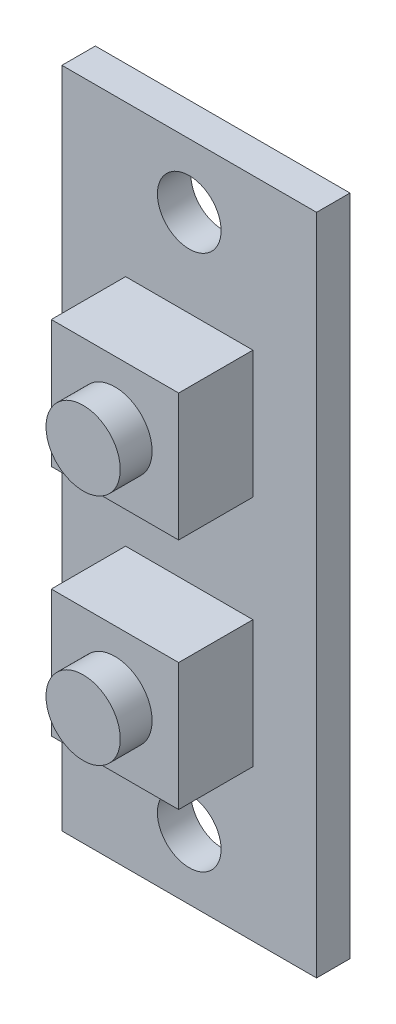
ISO-10303-21;
HEADER;
FILE_DESCRIPTION(('STEP AP214'),'2;1');
FILE_NAME('part.step','',(''),(''),'','','');
FILE_SCHEMA(('AUTOMOTIVE_DESIGN { 1 0 10303 214 1 1 1 1 }'));
ENDSEC;
DATA;
#1=APPLICATION_CONTEXT('core data for automotive mechanical design processes');
#2=APPLICATION_PROTOCOL_DEFINITION('international standard','automotive_design',2000,#1);
#3=PRODUCT_CONTEXT('',#1,'mechanical');
#4=PRODUCT('Part','Part','',(#3));
#5=PRODUCT_RELATED_PRODUCT_CATEGORY('part','',(#4));
#6=PRODUCT_DEFINITION_FORMATION('','',#4);
#7=PRODUCT_DEFINITION_CONTEXT('part definition',#1,'design');
#8=PRODUCT_DEFINITION('design','',#6,#7);
#9=PRODUCT_DEFINITION_SHAPE('','',#8);
#10=(LENGTH_UNIT() NAMED_UNIT(*) SI_UNIT(.MILLI.,.METRE.));
#11=(NAMED_UNIT(*) PLANE_ANGLE_UNIT() SI_UNIT($,.RADIAN.));
#12=(NAMED_UNIT(*) SI_UNIT($,.STERADIAN.) SOLID_ANGLE_UNIT());
#13=UNCERTAINTY_MEASURE_WITH_UNIT(LENGTH_MEASURE(1.E-05),#10,'distance_accuracy_value','');
#14=(GEOMETRIC_REPRESENTATION_CONTEXT(3) GLOBAL_UNCERTAINTY_ASSIGNED_CONTEXT((#13)) GLOBAL_UNIT_ASSIGNED_CONTEXT((#10,
#11,#12)) REPRESENTATION_CONTEXT('',''));
#15=CARTESIAN_POINT('',(0.,0.,0.));
#16=DIRECTION('',(0.,0.,1.));
#17=DIRECTION('',(1.,0.,0.));
#18=AXIS2_PLACEMENT_3D('',#15,#16,#17);
#19=CARTESIAN_POINT('',(0.,0.,1.6002));
#20=DIRECTION('',(0.,0.,-1.));
#21=DIRECTION('',(-1.,0.,0.));
#22=AXIS2_PLACEMENT_3D('',#19,#20,#21);
#23=PLANE('',#22);
#24=CARTESIAN_POINT('',(0.,12.827,1.6002));
#25=DIRECTION('',(0.,0.,-1.));
#26=DIRECTION('',(-1.,0.,0.));
#27=AXIS2_PLACEMENT_3D('',#24,#25,#26);
#28=CIRCLE('',#27,1.524);
#29=CARTESIAN_POINT('',(-1.524,12.827,1.6002));
#30=VERTEX_POINT('',#29);
#31=EDGE_CURVE('E430',#30,#30,#28,.T.);
#32=ORIENTED_EDGE('',*,*,#31,.T.);
#33=EDGE_LOOP('',(#32));
#34=FACE_BOUND('',#33,.T.);
#35=CARTESIAN_POINT('',(0.,-12.827,1.6002));
#36=DIRECTION('',(0.,0.,-1.));
#37=DIRECTION('',(-1.,0.,0.));
#38=AXIS2_PLACEMENT_3D('',#35,#36,#37);
#39=CIRCLE('',#38,1.524);
#40=CARTESIAN_POINT('',(-1.524,-12.827,1.6002));
#41=VERTEX_POINT('',#40);
#42=EDGE_CURVE('E432',#41,#41,#39,.T.);
#43=ORIENTED_EDGE('',*,*,#42,.T.);
#44=EDGE_LOOP('',(#43));
#45=FACE_BOUND('',#44,.T.);
#46=DIRECTION('',(0.,-1.,0.));
#47=VECTOR('',#46,1.);
#48=CARTESIAN_POINT('',(-3.048,2.54,1.6002));
#49=LINE('',#48,#47);
#50=CARTESIAN_POINT('',(-3.048,8.636,1.6002));
#51=VERTEX_POINT('',#50);
#52=CARTESIAN_POINT('',(-3.048,2.54,1.6002));
#53=VERTEX_POINT('',#52);
#54=EDGE_CURVE('E147',#51,#53,#49,.T.);
#55=ORIENTED_EDGE('',*,*,#54,.F.);
#56=DIRECTION('',(-1.,0.,0.));
#57=VECTOR('',#56,1.);
#58=CARTESIAN_POINT('',(-3.048,8.636,1.6002));
#59=LINE('',#58,#57);
#60=CARTESIAN_POINT('',(3.048,8.636,1.6002));
#61=VERTEX_POINT('',#60);
#62=EDGE_CURVE('E160',#61,#51,#59,.T.);
#63=ORIENTED_EDGE('',*,*,#62,.F.);
#64=DIRECTION('',(0.,1.,0.));
#65=VECTOR('',#64,1.);
#66=CARTESIAN_POINT('',(3.048,2.54,1.6002));
#67=LINE('',#66,#65);
#68=CARTESIAN_POINT('',(3.048,2.54,1.6002));
#69=VERTEX_POINT('',#68);
#70=EDGE_CURVE('E169',#69,#61,#67,.T.);
#71=ORIENTED_EDGE('',*,*,#70,.F.);
#72=DIRECTION('',(1.,0.,0.));
#73=VECTOR('',#72,1.);
#74=CARTESIAN_POINT('',(-3.048,2.54,1.6002));
#75=LINE('',#74,#73);
#76=EDGE_CURVE('E150',#53,#69,#75,.T.);
#77=ORIENTED_EDGE('',*,*,#76,.F.);
#78=EDGE_LOOP('',(#55,#63,#71,#77));
#79=FACE_BOUND('',#78,.T.);
#80=DIRECTION('',(0.,1.,0.));
#81=VECTOR('',#80,1.);
#82=CARTESIAN_POINT('',(6.096,-15.875,1.6002));
#83=LINE('',#82,#81);
#84=CARTESIAN_POINT('',(6.096,-15.875,1.6002));
#85=VERTEX_POINT('',#84);
#86=CARTESIAN_POINT('',(6.096,15.875,1.6002));
#87=VERTEX_POINT('',#86);
#88=EDGE_CURVE('E186',#85,#87,#83,.T.);
#89=ORIENTED_EDGE('',*,*,#88,.T.);
#90=DIRECTION('',(-1.,0.,0.));
#91=VECTOR('',#90,1.);
#92=CARTESIAN_POINT('',(-6.096,15.875,1.6002));
#93=LINE('',#92,#91);
#94=CARTESIAN_POINT('',(-6.096,15.875,1.6002));
#95=VERTEX_POINT('',#94);
#96=EDGE_CURVE('E189',#87,#95,#93,.T.);
#97=ORIENTED_EDGE('',*,*,#96,.T.);
#98=DIRECTION('',(0.,-1.,0.));
#99=VECTOR('',#98,1.);
#100=CARTESIAN_POINT('',(-6.096,-15.875,1.6002));
#101=LINE('',#100,#99);
#102=CARTESIAN_POINT('',(-6.096,-15.875,1.6002));
#103=VERTEX_POINT('',#102);
#104=EDGE_CURVE('E192',#95,#103,#101,.T.);
#105=ORIENTED_EDGE('',*,*,#104,.T.);
#106=DIRECTION('',(1.,0.,0.));
#107=VECTOR('',#106,1.);
#108=CARTESIAN_POINT('',(-6.096,-15.875,1.6002));
#109=LINE('',#108,#107);
#110=EDGE_CURVE('E194',#103,#85,#109,.T.);
#111=ORIENTED_EDGE('',*,*,#110,.T.);
#112=EDGE_LOOP('',(#89,#97,#105,#111));
#113=FACE_BOUND('',#112,.T.);
#114=DIRECTION('',(0.,-1.,0.));
#115=VECTOR('',#114,1.);
#116=CARTESIAN_POINT('',(-3.048,-2.54,1.6002));
#117=LINE('',#116,#115);
#118=CARTESIAN_POINT('',(-3.048,-2.54,1.6002));
#119=VERTEX_POINT('',#118);
#120=CARTESIAN_POINT('',(-3.048,-8.636,1.6002));
#121=VERTEX_POINT('',#120);
#122=EDGE_CURVE('E146',#119,#121,#117,.T.);
#123=ORIENTED_EDGE('',*,*,#122,.F.);
#124=DIRECTION('',(-1.,0.,0.));
#125=VECTOR('',#124,1.);
#126=CARTESIAN_POINT('',(-3.048,-2.54,1.6002));
#127=LINE('',#126,#125);
#128=CARTESIAN_POINT('',(3.048,-2.54,1.6002));
#129=VERTEX_POINT('',#128);
#130=EDGE_CURVE('E143',#129,#119,#127,.T.);
#131=ORIENTED_EDGE('',*,*,#130,.F.);
#132=DIRECTION('',(0.,1.,0.));
#133=VECTOR('',#132,1.);
#134=CARTESIAN_POINT('',(3.048,-2.54,1.6002));
#135=LINE('',#134,#133);
#136=CARTESIAN_POINT('',(3.048,-8.636,1.6002));
#137=VERTEX_POINT('',#136);
#138=EDGE_CURVE('E57',#137,#129,#135,.T.);
#139=ORIENTED_EDGE('',*,*,#138,.F.);
#140=DIRECTION('',(1.,0.,0.));
#141=VECTOR('',#140,1.);
#142=CARTESIAN_POINT('',(-3.048,-8.636,1.6002));
#143=LINE('',#142,#141);
#144=EDGE_CURVE('E52',#121,#137,#143,.T.);
#145=ORIENTED_EDGE('',*,*,#144,.F.);
#146=EDGE_LOOP('',(#123,#131,#139,#145));
#147=FACE_BOUND('',#146,.T.);
#148=ADVANCED_FACE('F35',(#34,#45,#79,#113,#147),#23,.F.);
#149=CARTESIAN_POINT('',(6.096,-15.875,1.6002));
#150=DIRECTION('',(-1.,0.,0.));
#151=DIRECTION('',(0.,0.,1.));
#152=AXIS2_PLACEMENT_3D('',#149,#150,#151);
#153=PLANE('',#152);
#154=DIRECTION('',(0.,1.,0.));
#155=VECTOR('',#154,1.);
#156=CARTESIAN_POINT('',(6.096,-15.875,0.));
#157=LINE('',#156,#155);
#158=CARTESIAN_POINT('',(6.096,-15.875,0.));
#159=VERTEX_POINT('',#158);
#160=CARTESIAN_POINT('',(6.096,15.875,0.));
#161=VERTEX_POINT('',#160);
#162=EDGE_CURVE('E185',#159,#161,#157,.T.);
#163=ORIENTED_EDGE('',*,*,#162,.T.);
#164=DIRECTION('',(0.,0.,-1.));
#165=VECTOR('',#164,1.);
#166=CARTESIAN_POINT('',(6.096,15.875,1.6002));
#167=LINE('',#166,#165);
#168=EDGE_CURVE('E39',#87,#161,#167,.T.);
#169=ORIENTED_EDGE('',*,*,#168,.F.);
#170=ORIENTED_EDGE('',*,*,#88,.F.);
#171=DIRECTION('',(0.,0.,-1.));
#172=VECTOR('',#171,1.);
#173=CARTESIAN_POINT('',(6.096,-15.875,1.6002));
#174=LINE('',#173,#172);
#175=EDGE_CURVE('E196',#85,#159,#174,.T.);
#176=ORIENTED_EDGE('',*,*,#175,.T.);
#177=EDGE_LOOP('',(#163,#169,#170,#176));
#178=FACE_BOUND('',#177,.T.);
#179=ADVANCED_FACE('F37',(#178),#153,.F.);
#180=CARTESIAN_POINT('',(-6.096,15.875,1.6002));
#181=DIRECTION('',(0.,-1.,0.));
#182=DIRECTION('',(0.,0.,-1.));
#183=AXIS2_PLACEMENT_3D('',#180,#181,#182);
#184=PLANE('',#183);
#185=DIRECTION('',(-1.,0.,0.));
#186=VECTOR('',#185,1.);
#187=CARTESIAN_POINT('',(-6.096,15.875,0.));
#188=LINE('',#187,#186);
#189=CARTESIAN_POINT('',(-6.096,15.875,0.));
#190=VERTEX_POINT('',#189);
#191=EDGE_CURVE('E199',#161,#190,#188,.T.);
#192=ORIENTED_EDGE('',*,*,#191,.T.);
#193=DIRECTION('',(0.,0.,-1.));
#194=VECTOR('',#193,1.);
#195=CARTESIAN_POINT('',(-6.096,15.875,1.6002));
#196=LINE('',#195,#194);
#197=EDGE_CURVE('E208',#95,#190,#196,.T.);
#198=ORIENTED_EDGE('',*,*,#197,.F.);
#199=ORIENTED_EDGE('',*,*,#96,.F.);
#200=ORIENTED_EDGE('',*,*,#168,.T.);
#201=EDGE_LOOP('',(#192,#198,#199,#200));
#202=FACE_BOUND('',#201,.T.);
#203=ADVANCED_FACE('F252',(#202),#184,.F.);
#204=CARTESIAN_POINT('',(-6.096,-15.875,1.6002));
#205=DIRECTION('',(1.,0.,0.));
#206=DIRECTION('',(0.,0.,-1.));
#207=AXIS2_PLACEMENT_3D('',#204,#205,#206);
#208=PLANE('',#207);
#209=DIRECTION('',(0.,-1.,0.));
#210=VECTOR('',#209,1.);
#211=CARTESIAN_POINT('',(-6.096,-15.875,0.));
#212=LINE('',#211,#210);
#213=CARTESIAN_POINT('',(-6.096,-15.875,0.));
#214=VERTEX_POINT('',#213);
#215=EDGE_CURVE('E201',#190,#214,#212,.T.);
#216=ORIENTED_EDGE('',*,*,#215,.T.);
#217=DIRECTION('',(0.,0.,-1.));
#218=VECTOR('',#217,1.);
#219=CARTESIAN_POINT('',(-6.096,-15.875,1.6002));
#220=LINE('',#219,#218);
#221=EDGE_CURVE('E206',#103,#214,#220,.T.);
#222=ORIENTED_EDGE('',*,*,#221,.F.);
#223=ORIENTED_EDGE('',*,*,#104,.F.);
#224=ORIENTED_EDGE('',*,*,#197,.T.);
#225=EDGE_LOOP('',(#216,#222,#223,#224));
#226=FACE_BOUND('',#225,.T.);
#227=ADVANCED_FACE('F267',(#226),#208,.F.);
#228=CARTESIAN_POINT('',(-6.096,-15.875,1.6002));
#229=DIRECTION('',(0.,1.,0.));
#230=DIRECTION('',(0.,0.,1.));
#231=AXIS2_PLACEMENT_3D('',#228,#229,#230);
#232=PLANE('',#231);
#233=DIRECTION('',(1.,0.,0.));
#234=VECTOR('',#233,1.);
#235=CARTESIAN_POINT('',(-6.096,-15.875,0.));
#236=LINE('',#235,#234);
#237=EDGE_CURVE('E190',#214,#159,#236,.T.);
#238=ORIENTED_EDGE('',*,*,#237,.T.);
#239=ORIENTED_EDGE('',*,*,#175,.F.);
#240=ORIENTED_EDGE('',*,*,#110,.F.);
#241=ORIENTED_EDGE('',*,*,#221,.T.);
#242=EDGE_LOOP('',(#238,#239,#240,#241));
#243=FACE_BOUND('',#242,.T.);
#244=ADVANCED_FACE('F263',(#243),#232,.F.);
#245=CARTESIAN_POINT('',(0.,0.,0.));
#246=DIRECTION('',(0.,0.,-1.));
#247=DIRECTION('',(-1.,0.,0.));
#248=AXIS2_PLACEMENT_3D('',#245,#246,#247);
#249=PLANE('',#248);
#250=CARTESIAN_POINT('',(0.,12.827,0.));
#251=DIRECTION('',(0.,0.,1.));
#252=DIRECTION('',(1.,0.,0.));
#253=AXIS2_PLACEMENT_3D('',#250,#251,#252);
#254=CIRCLE('',#253,1.524);
#255=CARTESIAN_POINT('',(1.524,12.827,0.));
#256=VERTEX_POINT('',#255);
#257=EDGE_CURVE('E428',#256,#256,#254,.T.);
#258=ORIENTED_EDGE('',*,*,#257,.T.);
#259=EDGE_LOOP('',(#258));
#260=FACE_BOUND('',#259,.T.);
#261=CARTESIAN_POINT('',(0.,-12.827,0.));
#262=DIRECTION('',(0.,0.,1.));
#263=DIRECTION('',(1.,0.,0.));
#264=AXIS2_PLACEMENT_3D('',#261,#262,#263);
#265=CIRCLE('',#264,1.524);
#266=CARTESIAN_POINT('',(1.524,-12.827,0.));
#267=VERTEX_POINT('',#266);
#268=EDGE_CURVE('E439',#267,#267,#265,.T.);
#269=ORIENTED_EDGE('',*,*,#268,.T.);
#270=EDGE_LOOP('',(#269));
#271=FACE_BOUND('',#270,.T.);
#272=ORIENTED_EDGE('',*,*,#162,.F.);
#273=ORIENTED_EDGE('',*,*,#237,.F.);
#274=ORIENTED_EDGE('',*,*,#215,.F.);
#275=ORIENTED_EDGE('',*,*,#191,.F.);
#276=EDGE_LOOP('',(#272,#273,#274,#275));
#277=FACE_BOUND('',#276,.T.);
#278=ADVANCED_FACE('F260',(#260,#271,#277),#249,.T.);
#279=CARTESIAN_POINT('',(-3.048,2.54,5.1562));
#280=DIRECTION('',(1.,0.,0.));
#281=DIRECTION('',(0.,0.,-1.));
#282=AXIS2_PLACEMENT_3D('',#279,#280,#281);
#283=PLANE('',#282);
#284=ORIENTED_EDGE('',*,*,#54,.T.);
#285=DIRECTION('',(0.,0.,-1.));
#286=VECTOR('',#285,1.);
#287=CARTESIAN_POINT('',(-3.048,2.54,5.1562));
#288=LINE('',#287,#286);
#289=CARTESIAN_POINT('',(-3.048,2.54,5.1562));
#290=VERTEX_POINT('',#289);
#291=EDGE_CURVE('E182',#290,#53,#288,.T.);
#292=ORIENTED_EDGE('',*,*,#291,.F.);
#293=DIRECTION('',(0.,-1.,0.));
#294=VECTOR('',#293,1.);
#295=CARTESIAN_POINT('',(-3.048,2.54,5.1562));
#296=LINE('',#295,#294);
#297=CARTESIAN_POINT('',(-3.048,8.636,5.1562));
#298=VERTEX_POINT('',#297);
#299=EDGE_CURVE('E156',#298,#290,#296,.T.);
#300=ORIENTED_EDGE('',*,*,#299,.F.);
#301=DIRECTION('',(0.,0.,-1.));
#302=VECTOR('',#301,1.);
#303=CARTESIAN_POINT('',(-3.048,8.636,5.1562));
#304=LINE('',#303,#302);
#305=EDGE_CURVE('E165',#298,#51,#304,.T.);
#306=ORIENTED_EDGE('',*,*,#305,.T.);
#307=EDGE_LOOP('',(#284,#292,#300,#306));
#308=FACE_BOUND('',#307,.T.);
#309=ADVANCED_FACE('F258',(#308),#283,.F.);
#310=CARTESIAN_POINT('',(-3.048,2.54,5.1562));
#311=DIRECTION('',(0.,1.,0.));
#312=DIRECTION('',(0.,0.,1.));
#313=AXIS2_PLACEMENT_3D('',#310,#311,#312);
#314=PLANE('',#313);
#315=ORIENTED_EDGE('',*,*,#76,.T.);
#316=DIRECTION('',(0.,0.,-1.));
#317=VECTOR('',#316,1.);
#318=CARTESIAN_POINT('',(3.048,2.54,5.1562));
#319=LINE('',#318,#317);
#320=CARTESIAN_POINT('',(3.048,2.54,5.1562));
#321=VERTEX_POINT('',#320);
#322=EDGE_CURVE('E179',#321,#69,#319,.T.);
#323=ORIENTED_EDGE('',*,*,#322,.F.);
#324=DIRECTION('',(1.,0.,0.));
#325=VECTOR('',#324,1.);
#326=CARTESIAN_POINT('',(-3.048,2.54,5.1562));
#327=LINE('',#326,#325);
#328=EDGE_CURVE('E159',#290,#321,#327,.T.);
#329=ORIENTED_EDGE('',*,*,#328,.F.);
#330=ORIENTED_EDGE('',*,*,#291,.T.);
#331=EDGE_LOOP('',(#315,#323,#329,#330));
#332=FACE_BOUND('',#331,.T.);
#333=ADVANCED_FACE('F302',(#332),#314,.F.);
#334=CARTESIAN_POINT('',(3.048,2.54,5.1562));
#335=DIRECTION('',(-1.,0.,0.));
#336=DIRECTION('',(0.,0.,1.));
#337=AXIS2_PLACEMENT_3D('',#334,#335,#336);
#338=PLANE('',#337);
#339=ORIENTED_EDGE('',*,*,#70,.T.);
#340=DIRECTION('',(0.,0.,-1.));
#341=VECTOR('',#340,1.);
#342=CARTESIAN_POINT('',(3.048,8.636,5.1562));
#343=LINE('',#342,#341);
#344=CARTESIAN_POINT('',(3.048,8.636,5.1562));
#345=VERTEX_POINT('',#344);
#346=EDGE_CURVE('E176',#345,#61,#343,.T.);
#347=ORIENTED_EDGE('',*,*,#346,.F.);
#348=DIRECTION('',(0.,1.,0.));
#349=VECTOR('',#348,1.);
#350=CARTESIAN_POINT('',(3.048,2.54,5.1562));
#351=LINE('',#350,#349);
#352=EDGE_CURVE('E162',#321,#345,#351,.T.);
#353=ORIENTED_EDGE('',*,*,#352,.F.);
#354=ORIENTED_EDGE('',*,*,#322,.T.);
#355=EDGE_LOOP('',(#339,#347,#353,#354));
#356=FACE_BOUND('',#355,.T.);
#357=ADVANCED_FACE('F309',(#356),#338,.F.);
#358=CARTESIAN_POINT('',(-3.048,8.636,5.1562));
#359=DIRECTION('',(0.,-1.,0.));
#360=DIRECTION('',(1.,0.,0.));
#361=AXIS2_PLACEMENT_3D('',#358,#359,#360);
#362=PLANE('',#361);
#363=ORIENTED_EDGE('',*,*,#62,.T.);
#364=ORIENTED_EDGE('',*,*,#305,.F.);
#365=DIRECTION('',(-1.,0.,0.));
#366=VECTOR('',#365,1.);
#367=CARTESIAN_POINT('',(-3.048,8.636,5.1562));
#368=LINE('',#367,#366);
#369=EDGE_CURVE('E164',#345,#298,#368,.T.);
#370=ORIENTED_EDGE('',*,*,#369,.F.);
#371=ORIENTED_EDGE('',*,*,#346,.T.);
#372=EDGE_LOOP('',(#363,#364,#370,#371));
#373=FACE_BOUND('',#372,.T.);
#374=ADVANCED_FACE('F316',(#373),#362,.F.);
#375=CARTESIAN_POINT('',(0.,0.,5.1562));
#376=DIRECTION('',(0.,0.,-1.));
#377=DIRECTION('',(-1.,0.,0.));
#378=AXIS2_PLACEMENT_3D('',#375,#376,#377);
#379=PLANE('',#378);
#380=CARTESIAN_POINT('',(0.,5.588,5.1562));
#381=DIRECTION('',(0.,0.,1.));
#382=DIRECTION('',(1.,0.,0.));
#383=AXIS2_PLACEMENT_3D('',#380,#381,#382);
#384=CIRCLE('',#383,1.778);
#385=CARTESIAN_POINT('',(-1.778,5.588,5.1562));
#386=VERTEX_POINT('',#385);
#387=EDGE_CURVE('E44',#386,#386,#384,.T.);
#388=ORIENTED_EDGE('',*,*,#387,.F.);
#389=EDGE_LOOP('',(#388));
#390=FACE_BOUND('',#389,.T.);
#391=ORIENTED_EDGE('',*,*,#299,.T.);
#392=ORIENTED_EDGE('',*,*,#328,.T.);
#393=ORIENTED_EDGE('',*,*,#352,.T.);
#394=ORIENTED_EDGE('',*,*,#369,.T.);
#395=EDGE_LOOP('',(#391,#392,#393,#394));
#396=FACE_BOUND('',#395,.T.);
#397=ADVANCED_FACE('F324',(#390,#396),#379,.F.);
#398=CARTESIAN_POINT('',(-3.048,-2.54,5.1562));
#399=DIRECTION('',(1.,0.,0.));
#400=DIRECTION('',(0.,1.,0.));
#401=AXIS2_PLACEMENT_3D('',#398,#399,#400);
#402=PLANE('',#401);
#403=ORIENTED_EDGE('',*,*,#122,.T.);
#404=DIRECTION('',(0.,0.,-1.));
#405=VECTOR('',#404,1.);
#406=CARTESIAN_POINT('',(-3.048,-8.636,5.1562));
#407=LINE('',#406,#405);
#408=CARTESIAN_POINT('',(-3.048,-8.636,5.1562));
#409=VERTEX_POINT('',#408);
#410=EDGE_CURVE('E127',#409,#121,#407,.T.);
#411=ORIENTED_EDGE('',*,*,#410,.F.);
#412=DIRECTION('',(0.,-1.,0.));
#413=VECTOR('',#412,1.);
#414=CARTESIAN_POINT('',(-3.048,-2.54,5.1562));
#415=LINE('',#414,#413);
#416=CARTESIAN_POINT('',(-3.048,-2.54,5.1562));
#417=VERTEX_POINT('',#416);
#418=EDGE_CURVE('E134',#417,#409,#415,.T.);
#419=ORIENTED_EDGE('',*,*,#418,.F.);
#420=DIRECTION('',(0.,0.,-1.));
#421=VECTOR('',#420,1.);
#422=CARTESIAN_POINT('',(-3.048,-2.54,5.1562));
#423=LINE('',#422,#421);
#424=EDGE_CURVE('E226',#417,#119,#423,.T.);
#425=ORIENTED_EDGE('',*,*,#424,.T.);
#426=EDGE_LOOP('',(#403,#411,#419,#425));
#427=FACE_BOUND('',#426,.T.);
#428=ADVANCED_FACE('F145',(#427),#402,.F.);
#429=CARTESIAN_POINT('',(-3.048,-8.636,5.1562));
#430=DIRECTION('',(0.,1.,0.));
#431=DIRECTION('',(0.,0.,1.));
#432=AXIS2_PLACEMENT_3D('',#429,#430,#431);
#433=PLANE('',#432);
#434=ORIENTED_EDGE('',*,*,#144,.T.);
#435=DIRECTION('',(0.,0.,-1.));
#436=VECTOR('',#435,1.);
#437=CARTESIAN_POINT('',(3.048,-8.636,5.1562));
#438=LINE('',#437,#436);
#439=CARTESIAN_POINT('',(3.048,-8.636,5.1562));
#440=VERTEX_POINT('',#439);
#441=EDGE_CURVE('E130',#440,#137,#438,.T.);
#442=ORIENTED_EDGE('',*,*,#441,.F.);
#443=DIRECTION('',(1.,0.,0.));
#444=VECTOR('',#443,1.);
#445=CARTESIAN_POINT('',(-3.048,-8.636,5.1562));
#446=LINE('',#445,#444);
#447=EDGE_CURVE('E123',#409,#440,#446,.T.);
#448=ORIENTED_EDGE('',*,*,#447,.F.);
#449=ORIENTED_EDGE('',*,*,#410,.T.);
#450=EDGE_LOOP('',(#434,#442,#448,#449));
#451=FACE_BOUND('',#450,.T.);
#452=ADVANCED_FACE('F125',(#451),#433,.F.);
#453=CARTESIAN_POINT('',(3.048,-2.54,5.1562));
#454=DIRECTION('',(-1.,0.,0.));
#455=DIRECTION('',(0.,-1.,0.));
#456=AXIS2_PLACEMENT_3D('',#453,#454,#455);
#457=PLANE('',#456);
#458=ORIENTED_EDGE('',*,*,#138,.T.);
#459=DIRECTION('',(0.,0.,-1.));
#460=VECTOR('',#459,1.);
#461=CARTESIAN_POINT('',(3.048,-2.54,5.1562));
#462=LINE('',#461,#460);
#463=CARTESIAN_POINT('',(3.048,-2.54,5.1562));
#464=VERTEX_POINT('',#463);
#465=EDGE_CURVE('E152',#464,#129,#462,.T.);
#466=ORIENTED_EDGE('',*,*,#465,.F.);
#467=DIRECTION('',(0.,1.,0.));
#468=VECTOR('',#467,1.);
#469=CARTESIAN_POINT('',(3.048,-2.54,5.1562));
#470=LINE('',#469,#468);
#471=EDGE_CURVE('E133',#440,#464,#470,.T.);
#472=ORIENTED_EDGE('',*,*,#471,.F.);
#473=ORIENTED_EDGE('',*,*,#441,.T.);
#474=EDGE_LOOP('',(#458,#466,#472,#473));
#475=FACE_BOUND('',#474,.T.);
#476=ADVANCED_FACE('F237',(#475),#457,.F.);
#477=CARTESIAN_POINT('',(-3.048,-2.54,5.1562));
#478=DIRECTION('',(0.,-1.,0.));
#479=DIRECTION('',(1.,0.,0.));
#480=AXIS2_PLACEMENT_3D('',#477,#478,#479);
#481=PLANE('',#480);
#482=ORIENTED_EDGE('',*,*,#130,.T.);
#483=ORIENTED_EDGE('',*,*,#424,.F.);
#484=DIRECTION('',(-1.,0.,0.));
#485=VECTOR('',#484,1.);
#486=CARTESIAN_POINT('',(-3.048,-2.54,5.1562));
#487=LINE('',#486,#485);
#488=EDGE_CURVE('E139',#464,#417,#487,.T.);
#489=ORIENTED_EDGE('',*,*,#488,.F.);
#490=ORIENTED_EDGE('',*,*,#465,.T.);
#491=EDGE_LOOP('',(#482,#483,#489,#490));
#492=FACE_BOUND('',#491,.T.);
#493=ADVANCED_FACE('F235',(#492),#481,.F.);
#494=CARTESIAN_POINT('',(0.,0.,5.1562));
#495=DIRECTION('',(0.,0.,1.));
#496=DIRECTION('',(1.,0.,0.));
#497=AXIS2_PLACEMENT_3D('',#494,#495,#496);
#498=PLANE('',#497);
#499=CARTESIAN_POINT('',(0.,-5.588,5.1562));
#500=DIRECTION('',(0.,0.,1.));
#501=DIRECTION('',(1.,0.,0.));
#502=AXIS2_PLACEMENT_3D('',#499,#500,#501);
#503=CIRCLE('',#502,1.778);
#504=CARTESIAN_POINT('',(-1.778,-5.588,5.1562));
#505=VERTEX_POINT('',#504);
#506=EDGE_CURVE('E11',#505,#505,#503,.T.);
#507=ORIENTED_EDGE('',*,*,#506,.F.);
#508=EDGE_LOOP('',(#507));
#509=FACE_BOUND('',#508,.T.);
#510=ORIENTED_EDGE('',*,*,#418,.T.);
#511=ORIENTED_EDGE('',*,*,#447,.T.);
#512=ORIENTED_EDGE('',*,*,#471,.T.);
#513=ORIENTED_EDGE('',*,*,#488,.T.);
#514=EDGE_LOOP('',(#510,#511,#512,#513));
#515=FACE_BOUND('',#514,.T.);
#516=ADVANCED_FACE('F137',(#509,#515),#498,.T.);
#517=CARTESIAN_POINT('',(0.,5.588,6.6802));
#518=DIRECTION('',(0.,0.,-1.));
#519=DIRECTION('',(-1.,0.,0.));
#520=AXIS2_PLACEMENT_3D('',#517,#518,#519);
#521=CYLINDRICAL_SURFACE('',#520,1.778);
#522=CARTESIAN_POINT('',(0.,5.588,6.6802));
#523=DIRECTION('',(0.,0.,1.));
#524=DIRECTION('',(1.,0.,0.));
#525=AXIS2_PLACEMENT_3D('',#522,#523,#524);
#526=CIRCLE('',#525,1.778);
#527=CARTESIAN_POINT('',(-1.778,5.588,6.6802));
#528=VERTEX_POINT('',#527);
#529=EDGE_CURVE('E222',#528,#528,#526,.T.);
#530=CARTESIAN_POINT('',(-1.778,5.588,6.6802));
#531=CARTESIAN_POINT('',(-1.778,5.588,6.664325));
#532=CARTESIAN_POINT('',(-1.778,5.588,6.64845));
#533=CARTESIAN_POINT('',(-1.778,5.588,6.6167));
#534=CARTESIAN_POINT('',(-1.778,5.588,6.600825));
#535=CARTESIAN_POINT('',(-1.778,5.588,6.569075));
#536=CARTESIAN_POINT('',(-1.778,5.588,6.5532));
#537=CARTESIAN_POINT('',(-1.778,5.588,6.52145));
#538=CARTESIAN_POINT('',(-1.778,5.588,6.505575));
#539=CARTESIAN_POINT('',(-1.778,5.588,6.473825));
#540=CARTESIAN_POINT('',(-1.778,5.588,6.45795));
#541=CARTESIAN_POINT('',(-1.778,5.588,6.4262));
#542=CARTESIAN_POINT('',(-1.778,5.588,6.410325));
#543=CARTESIAN_POINT('',(-1.778,5.588,6.378575));
#544=CARTESIAN_POINT('',(-1.778,5.588,6.3627));
#545=CARTESIAN_POINT('',(-1.778,5.588,6.33095));
#546=CARTESIAN_POINT('',(-1.778,5.588,6.315075));
#547=CARTESIAN_POINT('',(-1.778,5.588,6.283325));
#548=CARTESIAN_POINT('',(-1.778,5.588,6.26745));
#549=CARTESIAN_POINT('',(-1.778,5.588,6.2357));
#550=CARTESIAN_POINT('',(-1.778,5.588,6.219825));
#551=CARTESIAN_POINT('',(-1.778,5.588,6.188075));
#552=CARTESIAN_POINT('',(-1.778,5.588,6.1722));
#553=CARTESIAN_POINT('',(-1.778,5.588,6.14045));
#554=CARTESIAN_POINT('',(-1.778,5.588,6.124575));
#555=CARTESIAN_POINT('',(-1.778,5.588,6.092825));
#556=CARTESIAN_POINT('',(-1.778,5.588,6.07695));
#557=CARTESIAN_POINT('',(-1.778,5.588,6.0452));
#558=CARTESIAN_POINT('',(-1.778,5.588,6.029325));
#559=CARTESIAN_POINT('',(-1.778,5.588,5.997575));
#560=CARTESIAN_POINT('',(-1.778,5.588,5.9817));
#561=CARTESIAN_POINT('',(-1.778,5.588,5.94995));
#562=CARTESIAN_POINT('',(-1.778,5.588,5.934075));
#563=CARTESIAN_POINT('',(-1.778,5.588,5.902325));
#564=CARTESIAN_POINT('',(-1.778,5.588,5.88645));
#565=CARTESIAN_POINT('',(-1.778,5.588,5.8547));
#566=CARTESIAN_POINT('',(-1.778,5.588,5.838825));
#567=CARTESIAN_POINT('',(-1.778,5.588,5.807075));
#568=CARTESIAN_POINT('',(-1.778,5.588,5.7912));
#569=CARTESIAN_POINT('',(-1.778,5.588,5.75945));
#570=CARTESIAN_POINT('',(-1.778,5.588,5.743575));
#571=CARTESIAN_POINT('',(-1.778,5.588,5.711825));
#572=CARTESIAN_POINT('',(-1.778,5.588,5.69595));
#573=CARTESIAN_POINT('',(-1.778,5.588,5.6642));
#574=CARTESIAN_POINT('',(-1.778,5.588,5.648325));
#575=CARTESIAN_POINT('',(-1.778,5.588,5.616575));
#576=CARTESIAN_POINT('',(-1.778,5.588,5.6007));
#577=CARTESIAN_POINT('',(-1.778,5.588,5.56895));
#578=CARTESIAN_POINT('',(-1.778,5.588,5.553075));
#579=CARTESIAN_POINT('',(-1.778,5.588,5.521325));
#580=CARTESIAN_POINT('',(-1.778,5.588,5.50545));
#581=CARTESIAN_POINT('',(-1.778,5.588,5.4737));
#582=CARTESIAN_POINT('',(-1.778,5.588,5.457825));
#583=CARTESIAN_POINT('',(-1.778,5.588,5.426075));
#584=CARTESIAN_POINT('',(-1.778,5.588,5.4102));
#585=CARTESIAN_POINT('',(-1.778,5.588,5.37845));
#586=CARTESIAN_POINT('',(-1.778,5.588,5.362575));
#587=CARTESIAN_POINT('',(-1.778,5.588,5.330825));
#588=CARTESIAN_POINT('',(-1.778,5.588,5.31495));
#589=CARTESIAN_POINT('',(-1.778,5.588,5.2832));
#590=CARTESIAN_POINT('',(-1.778,5.588,5.267325));
#591=CARTESIAN_POINT('',(-1.778,5.588,5.235575));
#592=CARTESIAN_POINT('',(-1.778,5.588,5.2197));
#593=CARTESIAN_POINT('',(-1.778,5.588,5.18795));
#594=CARTESIAN_POINT('',(-1.778,5.588,5.172075));
#595=CARTESIAN_POINT('',(-1.778,5.588,5.1562));
#596=B_SPLINE_CURVE_WITH_KNOTS('',3,(#530,#531,#532,#533,#534,#535,#536,#537,#538,#539,#540,
#541,#542,#543,#544,#545,#546,#547,#548,#549,#550,#551,#552,#553,#554,#555,#556,#557,#558,#559,
#560,#561,#562,#563,#564,#565,#566,#567,#568,#569,#570,#571,#572,#573,#574,#575,#576,#577,#578,
#579,#580,#581,#582,#583,#584,#585,#586,#587,#588,#589,#590,#591,#592,#593,#594,#595),
.UNSPECIFIED.,.F.,.F.,(4,2,2,2,2,2,2,2,2,2,2,2,2,2,2,2,2,2,2,2,2,2,2,2,2,2,2,2,2,2,2,2,4),(0.,
0.0476249999999999,0.0952499999999998,0.142875,0.1905,0.238125,0.28575,0.333374999999999,
0.380999999999999,0.428624999999999,0.47625,0.523875,0.5715,0.619125,0.66675,0.714375,0.762,
0.809625,0.85725,0.904874999999999,0.9525,1.000125,1.04775,1.095375,1.143,1.190625,1.23825,
1.285875,1.3335,1.381125,1.42875,1.476375,1.524),.UNSPECIFIED.);
#597=EDGE_CURVE('BSEAM362',#528,#386,#596,.T.);
#598=ORIENTED_EDGE('',*,*,#529,.F.);
#599=ORIENTED_EDGE('',*,*,#387,.T.);
#600=ORIENTED_EDGE('',*,*,#597,.T.);
#601=ORIENTED_EDGE('',*,*,#597,.F.);
#602=EDGE_LOOP('',(#598,#600,#599,#601));
#603=FACE_BOUND('',#602,.T.);
#604=ADVANCED_FACE('F362',(#603),#521,.T.);
#605=CARTESIAN_POINT('',(0.,5.588,6.6802));
#606=DIRECTION('',(0.,0.,1.));
#607=DIRECTION('',(1.,0.,0.));
#608=AXIS2_PLACEMENT_3D('',#605,#606,#607);
#609=PLANE('',#608);
#610=ORIENTED_EDGE('',*,*,#529,.T.);
#611=EDGE_LOOP('',(#610));
#612=FACE_BOUND('',#611,.T.);
#613=ADVANCED_FACE('F369',(#612),#609,.T.);
#614=CARTESIAN_POINT('',(0.,-5.588,6.6802));
#615=DIRECTION('',(0.,0.,-1.));
#616=DIRECTION('',(-1.,0.,0.));
#617=AXIS2_PLACEMENT_3D('',#614,#615,#616);
#618=CYLINDRICAL_SURFACE('',#617,1.778);
#619=CARTESIAN_POINT('',(0.,-5.588,6.6802));
#620=DIRECTION('',(0.,0.,1.));
#621=DIRECTION('',(1.,0.,0.));
#622=AXIS2_PLACEMENT_3D('',#619,#620,#621);
#623=CIRCLE('',#622,1.778);
#624=CARTESIAN_POINT('',(-1.778,-5.588,6.6802));
#625=VERTEX_POINT('',#624);
#626=EDGE_CURVE('E431',#625,#625,#623,.T.);
#627=CARTESIAN_POINT('',(-1.778,-5.588,6.6802));
#628=CARTESIAN_POINT('',(-1.778,-5.588,6.664325));
#629=CARTESIAN_POINT('',(-1.778,-5.588,6.64845));
#630=CARTESIAN_POINT('',(-1.778,-5.588,6.6167));
#631=CARTESIAN_POINT('',(-1.778,-5.588,6.600825));
#632=CARTESIAN_POINT('',(-1.778,-5.588,6.569075));
#633=CARTESIAN_POINT('',(-1.778,-5.588,6.5532));
#634=CARTESIAN_POINT('',(-1.778,-5.588,6.52145));
#635=CARTESIAN_POINT('',(-1.778,-5.588,6.505575));
#636=CARTESIAN_POINT('',(-1.778,-5.588,6.473825));
#637=CARTESIAN_POINT('',(-1.778,-5.588,6.45795));
#638=CARTESIAN_POINT('',(-1.778,-5.588,6.4262));
#639=CARTESIAN_POINT('',(-1.778,-5.588,6.410325));
#640=CARTESIAN_POINT('',(-1.778,-5.588,6.378575));
#641=CARTESIAN_POINT('',(-1.778,-5.588,6.3627));
#642=CARTESIAN_POINT('',(-1.778,-5.588,6.33095));
#643=CARTESIAN_POINT('',(-1.778,-5.588,6.315075));
#644=CARTESIAN_POINT('',(-1.778,-5.588,6.283325));
#645=CARTESIAN_POINT('',(-1.778,-5.588,6.26745));
#646=CARTESIAN_POINT('',(-1.778,-5.588,6.2357));
#647=CARTESIAN_POINT('',(-1.778,-5.588,6.219825));
#648=CARTESIAN_POINT('',(-1.778,-5.588,6.188075));
#649=CARTESIAN_POINT('',(-1.778,-5.588,6.1722));
#650=CARTESIAN_POINT('',(-1.778,-5.588,6.14045));
#651=CARTESIAN_POINT('',(-1.778,-5.588,6.124575));
#652=CARTESIAN_POINT('',(-1.778,-5.588,6.092825));
#653=CARTESIAN_POINT('',(-1.778,-5.588,6.07695));
#654=CARTESIAN_POINT('',(-1.778,-5.588,6.0452));
#655=CARTESIAN_POINT('',(-1.778,-5.588,6.029325));
#656=CARTESIAN_POINT('',(-1.778,-5.588,5.997575));
#657=CARTESIAN_POINT('',(-1.778,-5.588,5.9817));
#658=CARTESIAN_POINT('',(-1.778,-5.588,5.94995));
#659=CARTESIAN_POINT('',(-1.778,-5.588,5.934075));
#660=CARTESIAN_POINT('',(-1.778,-5.588,5.902325));
#661=CARTESIAN_POINT('',(-1.778,-5.588,5.88645));
#662=CARTESIAN_POINT('',(-1.778,-5.588,5.8547));
#663=CARTESIAN_POINT('',(-1.778,-5.588,5.838825));
#664=CARTESIAN_POINT('',(-1.778,-5.588,5.807075));
#665=CARTESIAN_POINT('',(-1.778,-5.588,5.7912));
#666=CARTESIAN_POINT('',(-1.778,-5.588,5.75945));
#667=CARTESIAN_POINT('',(-1.778,-5.588,5.743575));
#668=CARTESIAN_POINT('',(-1.778,-5.588,5.711825));
#669=CARTESIAN_POINT('',(-1.778,-5.588,5.69595));
#670=CARTESIAN_POINT('',(-1.778,-5.588,5.6642));
#671=CARTESIAN_POINT('',(-1.778,-5.588,5.648325));
#672=CARTESIAN_POINT('',(-1.778,-5.588,5.616575));
#673=CARTESIAN_POINT('',(-1.778,-5.588,5.6007));
#674=CARTESIAN_POINT('',(-1.778,-5.588,5.56895));
#675=CARTESIAN_POINT('',(-1.778,-5.588,5.553075));
#676=CARTESIAN_POINT('',(-1.778,-5.588,5.521325));
#677=CARTESIAN_POINT('',(-1.778,-5.588,5.50545));
#678=CARTESIAN_POINT('',(-1.778,-5.588,5.4737));
#679=CARTESIAN_POINT('',(-1.778,-5.588,5.457825));
#680=CARTESIAN_POINT('',(-1.778,-5.588,5.426075));
#681=CARTESIAN_POINT('',(-1.778,-5.588,5.4102));
#682=CARTESIAN_POINT('',(-1.778,-5.588,5.37845));
#683=CARTESIAN_POINT('',(-1.778,-5.588,5.362575));
#684=CARTESIAN_POINT('',(-1.778,-5.588,5.330825));
#685=CARTESIAN_POINT('',(-1.778,-5.588,5.31495));
#686=CARTESIAN_POINT('',(-1.778,-5.588,5.2832));
#687=CARTESIAN_POINT('',(-1.778,-5.588,5.267325));
#688=CARTESIAN_POINT('',(-1.778,-5.588,5.235575));
#689=CARTESIAN_POINT('',(-1.778,-5.588,5.2197));
#690=CARTESIAN_POINT('',(-1.778,-5.588,5.18795));
#691=CARTESIAN_POINT('',(-1.778,-5.588,5.172075));
#692=CARTESIAN_POINT('',(-1.778,-5.588,5.1562));
#693=B_SPLINE_CURVE_WITH_KNOTS('',3,(#627,#628,#629,#630,#631,#632,#633,#634,#635,#636,#637,
#638,#639,#640,#641,#642,#643,#644,#645,#646,#647,#648,#649,#650,#651,#652,#653,#654,#655,#656,
#657,#658,#659,#660,#661,#662,#663,#664,#665,#666,#667,#668,#669,#670,#671,#672,#673,#674,#675,
#676,#677,#678,#679,#680,#681,#682,#683,#684,#685,#686,#687,#688,#689,#690,#691,#692),
.UNSPECIFIED.,.F.,.F.,(4,2,2,2,2,2,2,2,2,2,2,2,2,2,2,2,2,2,2,2,2,2,2,2,2,2,2,2,2,2,2,2,4),(0.,
0.0476249999999999,0.0952499999999998,0.142875,0.1905,0.238125,0.28575,0.333374999999999,
0.380999999999999,0.428624999999999,0.47625,0.523875,0.5715,0.619125,0.66675,0.714375,0.762,
0.809625,0.85725,0.904874999999999,0.9525,1.000125,1.04775,1.095375,1.143,1.190625,1.23825,
1.285875,1.3335,1.381125,1.42875,1.476375,1.524),.UNSPECIFIED.);
#694=EDGE_CURVE('BSEAM377',#625,#505,#693,.T.);
#695=ORIENTED_EDGE('',*,*,#626,.F.);
#696=ORIENTED_EDGE('',*,*,#506,.T.);
#697=ORIENTED_EDGE('',*,*,#694,.T.);
#698=ORIENTED_EDGE('',*,*,#694,.F.);
#699=EDGE_LOOP('',(#695,#697,#696,#698));
#700=FACE_BOUND('',#699,.T.);
#701=ADVANCED_FACE('F377',(#700),#618,.T.);
#702=CARTESIAN_POINT('',(0.,-5.588,6.6802));
#703=DIRECTION('',(0.,0.,1.));
#704=DIRECTION('',(1.,0.,0.));
#705=AXIS2_PLACEMENT_3D('',#702,#703,#704);
#706=PLANE('',#705);
#707=ORIENTED_EDGE('',*,*,#626,.T.);
#708=EDGE_LOOP('',(#707));
#709=FACE_BOUND('',#708,.T.);
#710=ADVANCED_FACE('F385',(#709),#706,.T.);
#711=CARTESIAN_POINT('',(0.,-12.827,0.));
#712=DIRECTION('',(0.,0.,1.));
#713=DIRECTION('',(1.,0.,0.));
#714=AXIS2_PLACEMENT_3D('',#711,#712,#713);
#715=CYLINDRICAL_SURFACE('',#714,1.524);
#716=ORIENTED_EDGE('',*,*,#268,.F.);
#717=EDGE_LOOP('',(#716));
#718=FACE_BOUND('',#717,.T.);
#719=ORIENTED_EDGE('',*,*,#42,.F.);
#720=EDGE_LOOP('',(#719));
#721=FACE_BOUND('',#720,.T.);
#722=ADVANCED_FACE('F393',(#718,#721),#715,.F.);
#723=CARTESIAN_POINT('',(0.,12.827,0.));
#724=DIRECTION('',(0.,0.,1.));
#725=DIRECTION('',(1.,0.,0.));
#726=AXIS2_PLACEMENT_3D('',#723,#724,#725);
#727=CYLINDRICAL_SURFACE('',#726,1.524);
#728=ORIENTED_EDGE('',*,*,#257,.F.);
#729=EDGE_LOOP('',(#728));
#730=FACE_BOUND('',#729,.T.);
#731=ORIENTED_EDGE('',*,*,#31,.F.);
#732=EDGE_LOOP('',(#731));
#733=FACE_BOUND('',#732,.T.);
#734=ADVANCED_FACE('F400',(#730,#733),#727,.F.);
#735=CLOSED_SHELL('',(#148,#179,#203,#227,#244,#278,#309,#333,#357,#374,#397,#428,#452,#476,
#493,#516,#604,#613,#701,#710,#722,#734));
#736=MANIFOLD_SOLID_BREP('B2',#735);
#737=ADVANCED_BREP_SHAPE_REPRESENTATION('',(#18,#736),#14);
#738=SHAPE_DEFINITION_REPRESENTATION(#9,#737);
ENDSEC;
END-ISO-10303-21;
